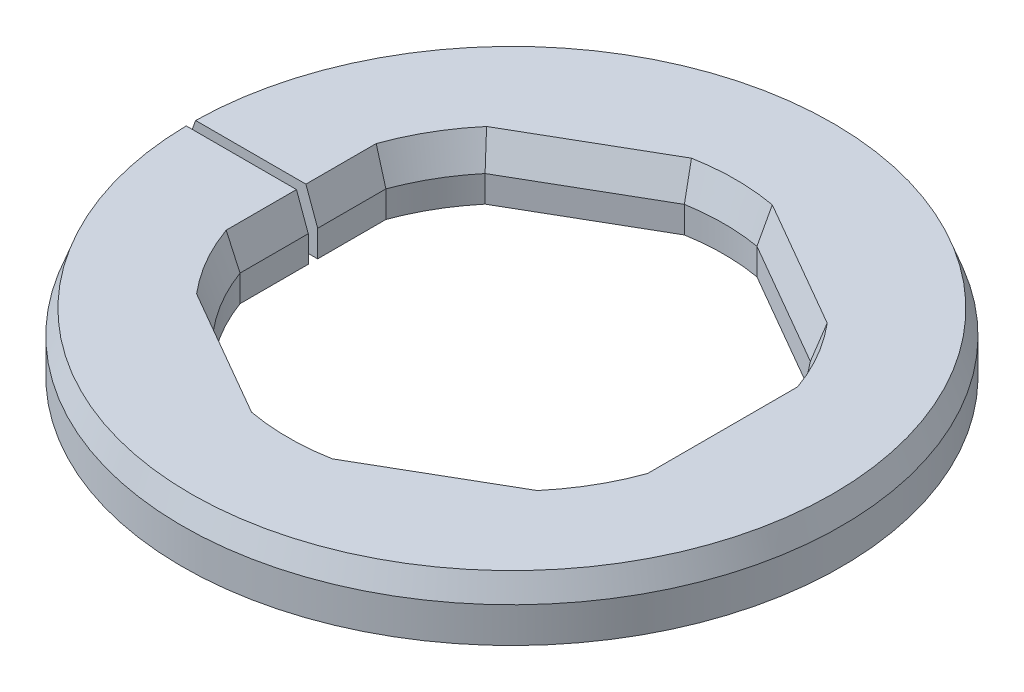
ISO-10303-21;
HEADER;
FILE_DESCRIPTION(('STEP AP214'),'2;1');
FILE_NAME('part.step','',(''),(''),'','','');
FILE_SCHEMA(('AUTOMOTIVE_DESIGN { 1 0 10303 214 1 1 1 1 }'));
ENDSEC;
DATA;
#1=APPLICATION_CONTEXT('core data for automotive mechanical design processes');
#2=APPLICATION_PROTOCOL_DEFINITION('international standard','automotive_design',2000,#1);
#3=PRODUCT_CONTEXT('',#1,'mechanical');
#4=PRODUCT('Part','Part','',(#3));
#5=PRODUCT_RELATED_PRODUCT_CATEGORY('part','',(#4));
#6=PRODUCT_DEFINITION_FORMATION('','',#4);
#7=PRODUCT_DEFINITION_CONTEXT('part definition',#1,'design');
#8=PRODUCT_DEFINITION('design','',#6,#7);
#9=PRODUCT_DEFINITION_SHAPE('','',#8);
#10=(LENGTH_UNIT() NAMED_UNIT(*) SI_UNIT(.MILLI.,.METRE.));
#11=(NAMED_UNIT(*) PLANE_ANGLE_UNIT() SI_UNIT($,.RADIAN.));
#12=(NAMED_UNIT(*) SI_UNIT($,.STERADIAN.) SOLID_ANGLE_UNIT());
#13=UNCERTAINTY_MEASURE_WITH_UNIT(LENGTH_MEASURE(1.E-05),#10,'distance_accuracy_value','');
#14=(GEOMETRIC_REPRESENTATION_CONTEXT(3) GLOBAL_UNCERTAINTY_ASSIGNED_CONTEXT((#13)) GLOBAL_UNIT_ASSIGNED_CONTEXT((#10,
#11,#12)) REPRESENTATION_CONTEXT('',''));
#15=CARTESIAN_POINT('',(0.,0.,0.));
#16=DIRECTION('',(0.,0.,1.));
#17=DIRECTION('',(1.,0.,0.));
#18=AXIS2_PLACEMENT_3D('',#15,#16,#17);
#19=CARTESIAN_POINT('',(-8.44999999989183,2.5,3.09798321482909));
#20=DIRECTION('',(1.,0.,0.));
#21=DIRECTION('',(0.,0.,-1.));
#22=AXIS2_PLACEMENT_3D('',#19,#20,#21);
#23=PLANE('',#22);
#24=DIRECTION('',(0.,1.,0.));
#25=VECTOR('',#24,1.);
#26=CARTESIAN_POINT('',(-8.44999999989183,2.5,-0.199999999999998));
#27=LINE('',#26,#25);
#28=CARTESIAN_POINT('',(-8.44999999989183,0.,-0.199999999999998));
#29=VERTEX_POINT('',#28);
#30=CARTESIAN_POINT('',(-8.44999999989183,1.12626129027269,-0.199999999999998));
#31=VERTEX_POINT('',#30);
#32=EDGE_CURVE('E205',#29,#31,#27,.T.);
#33=ORIENTED_EDGE('',*,*,#32,.F.);
#34=DIRECTION('',(0.,0.,1.));
#35=VECTOR('',#34,1.);
#36=CARTESIAN_POINT('',(-8.44999999989183,0.,3.09798321482909));
#37=LINE('',#36,#35);
#38=CARTESIAN_POINT('',(-8.44999999989183,0.,-3.09798321503491));
#39=VERTEX_POINT('',#38);
#40=EDGE_CURVE('E516',#39,#29,#37,.T.);
#41=ORIENTED_EDGE('',*,*,#40,.F.);
#42=DIRECTION('',(0.,-1.,0.));
#43=VECTOR('',#42,1.);
#44=CARTESIAN_POINT('',(-8.44999999989183,2.5,-3.09798321503491));
#45=LINE('',#44,#43);
#46=CARTESIAN_POINT('',(-8.44999999989183,1.12626129027269,-3.09798321503491));
#47=VERTEX_POINT('',#46);
#48=EDGE_CURVE('E502',#47,#39,#45,.T.);
#49=ORIENTED_EDGE('',*,*,#48,.F.);
#50=DIRECTION('',(0.,0.,1.));
#51=VECTOR('',#50,1.);
#52=CARTESIAN_POINT('',(-8.44999999989183,1.12626129027269,3.09798321482909));
#53=LINE('',#52,#51);
#54=EDGE_CURVE('E280',#47,#31,#53,.T.);
#55=ORIENTED_EDGE('',*,*,#54,.T.);
#56=EDGE_LOOP('',(#33,#41,#49,#55));
#57=FACE_BOUND('',#56,.T.);
#58=ADVANCED_FACE('F36',(#57),#23,.T.);
#59=CARTESIAN_POINT('',(-8.44999999989183,1.12626129027269,3.09798321482909));
#60=DIRECTION('',(-0.939692620785908,-0.342020143325671,0.));
#61=DIRECTION('',(0.,0.,1.));
#62=AXIS2_PLACEMENT_3D('',#59,#60,#61);
#63=PLANE('',#62);
#64=DIRECTION('',(0.342020143325671,-0.939692620785908,0.));
#65=VECTOR('',#64,1.);
#66=CARTESIAN_POINT('',(-8.44999999989183,1.12626129027269,-0.199999999999998));
#67=LINE('',#66,#65);
#68=CARTESIAN_POINT('',(-8.94999999989184,2.5,-0.199999999999998));
#69=VERTEX_POINT('',#68);
#70=EDGE_CURVE('E200',#31,#69,#67,.F.);
#71=ORIENTED_EDGE('',*,*,#70,.F.);
#72=ORIENTED_EDGE('',*,*,#54,.F.);
#73=CARTESIAN_POINT('',(-8.44999999989183,1.12626129027269,-3.09798321503491));
#74=CARTESIAN_POINT('',(-8.5333291870404,1.35520635034488,-3.11277417970992));
#75=CARTESIAN_POINT('',(-8.61666044747581,1.58415710672587,-3.12746390143958));
#76=CARTESIAN_POINT('',(-8.78332711414252,2.04207000996841,-3.15664085887206));
#77=CARTESIAN_POINT('',(-8.86666252037377,2.27103215682986,-3.17112809457677));
#78=CARTESIAN_POINT('',(-8.94999999989184,2.5,-3.18551408733803));
#79=B_SPLINE_CURVE_WITH_KNOTS('',3,(#73,#74,#75,#76,#77,#78),.UNSPECIFIED.,.F.,.F.,(4,2,4),(0.,
0.732260214431372,1.46452042202801),.UNSPECIFIED.);
#80=CARTESIAN_POINT('',(-8.94999999989184,2.5,-3.18551408733803));
#81=VERTEX_POINT('',#80);
#82=EDGE_CURVE('E226',#47,#81,#79,.T.);
#83=ORIENTED_EDGE('',*,*,#82,.T.);
#84=DIRECTION('',(0.,0.,-1.));
#85=VECTOR('',#84,1.);
#86=CARTESIAN_POINT('',(-8.94999999989184,2.5,6.51987144828503E-10));
#87=LINE('',#86,#85);
#88=EDGE_CURVE('E217',#69,#81,#87,.T.);
#89=ORIENTED_EDGE('',*,*,#88,.F.);
#90=EDGE_LOOP('',(#71,#72,#83,#89));
#91=FACE_BOUND('',#90,.T.);
#92=ADVANCED_FACE('F224',(#91),#63,.F.);
#93=CARTESIAN_POINT('',(5.49183125044051E-11,2.5,6.51987144828503E-10));
#94=DIRECTION('',(0.,1.,0.));
#95=DIRECTION('',(0.,0.,1.));
#96=AXIS2_PLACEMENT_3D('',#93,#94,#95);
#97=PLANE('',#96);
#98=DIRECTION('',(1.,0.,0.));
#99=VECTOR('',#98,1.);
#100=CARTESIAN_POINT('',(-17.4047921001665,2.5,0.200000000000002));
#101=LINE('',#100,#99);
#102=CARTESIAN_POINT('',(-13.6345629842229,2.5,0.200000000000002));
#103=VERTEX_POINT('',#102);
#104=CARTESIAN_POINT('',(-8.94999999989184,2.5,0.200000000000002));
#105=VERTEX_POINT('',#104);
#106=EDGE_CURVE('E221',#103,#105,#101,.T.);
#107=ORIENTED_EDGE('',*,*,#106,.F.);
#108=CARTESIAN_POINT('',(5.49183125044051E-11,2.5,6.51987144828503E-10));
#109=DIRECTION('',(0.,1.,0.));
#110=DIRECTION('',(0.,0.,1.));
#111=AXIS2_PLACEMENT_3D('',#108,#109,#110);
#112=CIRCLE('',#111,13.6360297657338);
#113=CARTESIAN_POINT('',(-13.6345629842038,2.5,-0.199999999999998));
#114=VERTEX_POINT('',#113);
#115=EDGE_CURVE('E210',#103,#114,#112,.T.);
#116=ORIENTED_EDGE('',*,*,#115,.T.);
#117=DIRECTION('',(-1.,0.,0.));
#118=VECTOR('',#117,1.);
#119=CARTESIAN_POINT('',(-17.4047921001665,2.5,-0.199999999999998));
#120=LINE('',#119,#118);
#121=EDGE_CURVE('E203',#69,#114,#120,.T.);
#122=ORIENTED_EDGE('',*,*,#121,.F.);
#123=ORIENTED_EDGE('',*,*,#88,.T.);
#124=CARTESIAN_POINT('',(-6.82127513029403E-10,2.5,-5.48507451092418E-10));
#125=DIRECTION('',(0.,1.,0.));
#126=DIRECTION('',(0.,0.,1.));
#127=AXIS2_PLACEMENT_3D('',#124,#125,#126);
#128=CIRCLE('',#127,9.49999999910464);
#129=CARTESIAN_POINT('',(-7.23373612364524,2.5,-6.1581703202398));
#130=VERTEX_POINT('',#129);
#131=EDGE_CURVE('E231',#81,#130,#128,.F.);
#132=ORIENTED_EDGE('',*,*,#131,.T.);
#133=DIRECTION('',(0.866025403784439,0.,-0.5));
#134=VECTOR('',#133,1.);
#135=CARTESIAN_POINT('',(-4.47500000023195,2.5,-7.75092736371561));
#136=LINE('',#135,#134);
#137=CARTESIAN_POINT('',(-1.71626387631926,2.5,-9.34368440747975));
#138=VERTEX_POINT('',#137);
#139=EDGE_CURVE('E238',#130,#138,#136,.T.);
#140=ORIENTED_EDGE('',*,*,#139,.T.);
#141=CARTESIAN_POINT('',(5.49183125044051E-11,2.5,6.51987144828503E-10));
#142=DIRECTION('',(0.,1.,0.));
#143=DIRECTION('',(0.,0.,1.));
#144=AXIS2_PLACEMENT_3D('',#141,#142,#143);
#145=CIRCLE('',#144,9.50000000063743);
#146=CARTESIAN_POINT('',(1.71626387633326,2.5,-9.34368440749735));
#147=VERTEX_POINT('',#146);
#148=EDGE_CURVE('E240',#138,#147,#145,.F.);
#149=ORIENTED_EDGE('',*,*,#148,.T.);
#150=DIRECTION('',(0.866025403784439,0.,0.5));
#151=VECTOR('',#150,1.);
#152=CARTESIAN_POINT('',(4.47500000032545,2.5,-7.75092736368732));
#153=LINE('',#152,#151);
#154=CARTESIAN_POINT('',(7.23373612366174,2.5,-6.15817032025597));
#155=VERTEX_POINT('',#154);
#156=EDGE_CURVE('E242',#147,#155,#153,.T.);
#157=ORIENTED_EDGE('',*,*,#156,.T.);
#158=CARTESIAN_POINT('',(3.36183591245036E-11,2.5,-1.37775181543098E-11));
#159=DIRECTION('',(0.,1.,0.));
#160=DIRECTION('',(0.,0.,1.));
#161=AXIS2_PLACEMENT_3D('',#158,#159,#160);
#162=CIRCLE('',#161,9.49999999996812);
#163=CARTESIAN_POINT('',(8.95000000000505,2.5,-3.18551408723826));
#164=VERTEX_POINT('',#163);
#165=EDGE_CURVE('E244',#155,#164,#162,.F.);
#166=ORIENTED_EDGE('',*,*,#165,.T.);
#167=DIRECTION('',(0.,0.,1.));
#168=VECTOR('',#167,1.);
#169=CARTESIAN_POINT('',(8.95000000000505,2.5,6.51987144828503E-10));
#170=LINE('',#169,#168);
#171=CARTESIAN_POINT('',(8.95000000000505,2.5,3.18551408723981));
#172=VERTEX_POINT('',#171);
#173=EDGE_CURVE('E246',#164,#172,#170,.T.);
#174=ORIENTED_EDGE('',*,*,#173,.T.);
#175=CARTESIAN_POINT('',(5.71074449468464E-11,2.5,4.01635526764568E-11));
#176=DIRECTION('',(0.,1.,0.));
#177=DIRECTION('',(0.,0.,1.));
#178=AXIS2_PLACEMENT_3D('',#175,#176,#177);
#179=CIRCLE('',#178,9.49999999993766);
#180=CARTESIAN_POINT('',(7.23373612366517,2.5,6.15817032025893));
#181=VERTEX_POINT('',#180);
#182=EDGE_CURVE('E248',#172,#181,#179,.F.);
#183=ORIENTED_EDGE('',*,*,#182,.T.);
#184=DIRECTION('',(-0.866025403784004,0.,0.500000000000753));
#185=VECTOR('',#184,1.);
#186=CARTESIAN_POINT('',(4.47499999977108,2.5,7.75092736401553));
#187=LINE('',#186,#185);
#188=CARTESIAN_POINT('',(1.71626387634008,2.5,9.34368440750476));
#189=VERTEX_POINT('',#188);
#190=EDGE_CURVE('E250',#181,#189,#187,.T.);
#191=ORIENTED_EDGE('',*,*,#190,.T.);
#192=CARTESIAN_POINT('',(5.49183125044051E-11,2.5,6.51987144828503E-10));
#193=DIRECTION('',(0.,1.,0.));
#194=DIRECTION('',(0.,0.,1.));
#195=AXIS2_PLACEMENT_3D('',#192,#193,#194);
#196=CIRCLE('',#195,9.49999999936342);
#197=CARTESIAN_POINT('',(-1.71626387635197,2.5,9.3436844074824));
#198=VERTEX_POINT('',#197);
#199=EDGE_CURVE('E252',#189,#198,#196,.F.);
#200=ORIENTED_EDGE('',*,*,#199,.T.);
#201=DIRECTION('',(-0.866025403768854,0.,-0.500000000026993));
#202=VECTOR('',#201,1.);
#203=CARTESIAN_POINT('',(-4.47499999986858,2.5,7.75092736383229));
#204=LINE('',#203,#202);
#205=CARTESIAN_POINT('',(-7.23373612359183,2.5,6.15817032006288));
#206=VERTEX_POINT('',#205);
#207=EDGE_CURVE('E254',#198,#206,#204,.T.);
#208=ORIENTED_EDGE('',*,*,#207,.T.);
#209=CARTESIAN_POINT('',(-6.62770753762795E-10,2.5,2.59207651671099E-10));
#210=DIRECTION('',(0.,1.,0.));
#211=DIRECTION('',(0.,0.,1.));
#212=AXIS2_PLACEMENT_3D('',#209,#210,#211);
#213=CIRCLE('',#212,9.49999999915155);
#214=CARTESIAN_POINT('',(-8.94999999989184,2.5,3.18551408713424));
#215=VERTEX_POINT('',#214);
#216=EDGE_CURVE('E256',#206,#215,#213,.F.);
#217=ORIENTED_EDGE('',*,*,#216,.T.);
#218=EDGE_CURVE('E227',#215,#105,#87,.T.);
#219=ORIENTED_EDGE('',*,*,#218,.T.);
#220=EDGE_LOOP('',(#107,#116,#122,#123,#132,#140,#149,#157,#166,#174,#183,#191,#200,#208,#217,#219));
#221=FACE_BOUND('',#220,.T.);
#222=ADVANCED_FACE('F216',(#221),#97,.T.);
#223=CARTESIAN_POINT('',(5.49183125044051E-11,0.,6.51987144828503E-10));
#224=DIRECTION('',(0.,1.,0.));
#225=DIRECTION('',(0.,0.,1.));
#226=AXIS2_PLACEMENT_3D('',#223,#224,#225);
#227=PLANE('',#226);
#228=ORIENTED_EDGE('',*,*,#40,.T.);
#229=DIRECTION('',(-1.,0.,0.));
#230=VECTOR('',#229,1.);
#231=CARTESIAN_POINT('',(-17.4047921001665,0.,-0.199999999999998));
#232=LINE('',#231,#230);
#233=CARTESIAN_POINT('',(-13.9985713556135,0.,-0.199999999999998));
#234=VERTEX_POINT('',#233);
#235=EDGE_CURVE('E479',#29,#234,#232,.T.);
#236=ORIENTED_EDGE('',*,*,#235,.T.);
#237=CARTESIAN_POINT('',(5.49183125044051E-11,0.,6.51987144828503E-10));
#238=DIRECTION('',(0.,1.,0.));
#239=DIRECTION('',(0.,0.,1.));
#240=AXIS2_PLACEMENT_3D('',#237,#238,#239);
#241=CIRCLE('',#240,14.);
#242=CARTESIAN_POINT('',(-13.9985713556321,0.,0.200000000000002));
#243=VERTEX_POINT('',#242);
#244=EDGE_CURVE('E233',#243,#234,#241,.T.);
#245=ORIENTED_EDGE('',*,*,#244,.F.);
#246=DIRECTION('',(1.,0.,0.));
#247=VECTOR('',#246,1.);
#248=CARTESIAN_POINT('',(-17.4047921001665,0.,0.200000000000002));
#249=LINE('',#248,#247);
#250=CARTESIAN_POINT('',(-8.44999999989183,0.,0.200000000000002));
#251=VERTEX_POINT('',#250);
#252=EDGE_CURVE('E220',#243,#251,#249,.T.);
#253=ORIENTED_EDGE('',*,*,#252,.T.);
#254=CARTESIAN_POINT('',(-8.44999999989183,0.,3.09798321482908));
#255=VERTEX_POINT('',#254);
#256=EDGE_CURVE('E474',#251,#255,#37,.T.);
#257=ORIENTED_EDGE('',*,*,#256,.T.);
#258=CARTESIAN_POINT('',(-6.62770753762795E-10,0.,2.59207651671099E-10));
#259=DIRECTION('',(0.,1.,0.));
#260=DIRECTION('',(0.,0.,1.));
#261=AXIS2_PLACEMENT_3D('',#258,#259,#260);
#262=CIRCLE('',#261,8.99999999915155);
#263=CARTESIAN_POINT('',(-6.90793216455626,0.,5.76892305432862));
#264=VERTEX_POINT('',#263);
#265=EDGE_CURVE('E527',#255,#264,#262,.T.);
#266=ORIENTED_EDGE('',*,*,#265,.T.);
#267=DIRECTION('',(0.866025403768854,0.,0.500000000026993));
#268=VECTOR('',#267,1.);
#269=CARTESIAN_POINT('',(-1.54206783537336,0.,8.86690626944038));
#270=LINE('',#269,#268);
#271=CARTESIAN_POINT('',(-1.54206783537336,0.,8.86690626944038));
#272=VERTEX_POINT('',#271);
#273=EDGE_CURVE('E498',#264,#272,#270,.T.);
#274=ORIENTED_EDGE('',*,*,#273,.T.);
#275=CARTESIAN_POINT('',(5.49183125044051E-11,0.,6.51987144828503E-10));
#276=DIRECTION('',(0.,1.,0.));
#277=DIRECTION('',(0.,0.,1.));
#278=AXIS2_PLACEMENT_3D('',#275,#276,#277);
#279=CIRCLE('',#278,8.99999999936341);
#280=CARTESIAN_POINT('',(1.54206783537201,0.,8.86690626945972));
#281=VERTEX_POINT('',#280);
#282=EDGE_CURVE('E530',#272,#281,#279,.T.);
#283=ORIENTED_EDGE('',*,*,#282,.T.);
#284=DIRECTION('',(0.866025403784004,0.,-0.500000000000753));
#285=VECTOR('',#284,1.);
#286=CARTESIAN_POINT('',(6.90793216463169,0.,5.76892305452042));
#287=LINE('',#286,#285);
#288=CARTESIAN_POINT('',(6.90793216463169,0.,5.76892305452042));
#289=VERTEX_POINT('',#288);
#290=EDGE_CURVE('E533',#281,#289,#287,.T.);
#291=ORIENTED_EDGE('',*,*,#290,.T.);
#292=CARTESIAN_POINT('',(5.71074449468464E-11,0.,4.01635526764568E-11));
#293=DIRECTION('',(0.,1.,0.));
#294=DIRECTION('',(0.,0.,1.));
#295=AXIS2_PLACEMENT_3D('',#292,#293,#294);
#296=CIRCLE('',#295,8.99999999993766);
#297=CARTESIAN_POINT('',(8.45000000000505,0.,3.09798321493299));
#298=VERTEX_POINT('',#297);
#299=EDGE_CURVE('E536',#289,#298,#296,.T.);
#300=ORIENTED_EDGE('',*,*,#299,.T.);
#301=DIRECTION('',(0.,0.,-1.));
#302=VECTOR('',#301,1.);
#303=CARTESIAN_POINT('',(8.45000000000505,0.,-3.09798321493101));
#304=LINE('',#303,#302);
#305=CARTESIAN_POINT('',(8.45000000000505,0.,-3.09798321493101));
#306=VERTEX_POINT('',#305);
#307=EDGE_CURVE('E539',#298,#306,#304,.T.);
#308=ORIENTED_EDGE('',*,*,#307,.T.);
#309=CARTESIAN_POINT('',(3.36183591245036E-11,0.,-1.37775181543098E-11));
#310=DIRECTION('',(0.,1.,0.));
#311=DIRECTION('',(0.,0.,1.));
#312=AXIS2_PLACEMENT_3D('',#309,#310,#311);
#313=CIRCLE('',#312,8.99999999996811);
#314=CARTESIAN_POINT('',(6.90793216462852,0.,-5.76892305451722));
#315=VERTEX_POINT('',#314);
#316=EDGE_CURVE('E542',#306,#315,#313,.T.);
#317=ORIENTED_EDGE('',*,*,#316,.T.);
#318=DIRECTION('',(-0.866025403784439,0.,-0.5));
#319=VECTOR('',#318,1.);
#320=CARTESIAN_POINT('',(1.542067835371,0.,-8.86690626944905));
#321=LINE('',#320,#319);
#322=CARTESIAN_POINT('',(1.542067835371,0.,-8.86690626944905));
#323=VERTEX_POINT('',#322);
#324=EDGE_CURVE('E545',#315,#323,#321,.T.);
#325=ORIENTED_EDGE('',*,*,#324,.T.);
#326=CARTESIAN_POINT('',(5.49183125044051E-11,0.,6.51987144828503E-10));
#327=DIRECTION('',(0.,1.,0.));
#328=DIRECTION('',(0.,0.,-1.));
#329=AXIS2_PLACEMENT_3D('',#326,#327,#328);
#330=CIRCLE('',#329,9.00000000063742);
#331=CARTESIAN_POINT('',(-1.54206783535467,0.,-8.86690626943279));
#332=VERTEX_POINT('',#331);
#333=EDGE_CURVE('E548',#323,#332,#330,.T.);
#334=ORIENTED_EDGE('',*,*,#333,.T.);
#335=DIRECTION('',(-0.866025403784439,0.,0.5));
#336=VECTOR('',#335,1.);
#337=CARTESIAN_POINT('',(-6.90793216461219,0.,-5.76892305450095));
#338=LINE('',#337,#336);
#339=CARTESIAN_POINT('',(-6.90793216461219,0.,-5.76892305450095));
#340=VERTEX_POINT('',#339);
#341=EDGE_CURVE('E551',#332,#340,#338,.T.);
#342=ORIENTED_EDGE('',*,*,#341,.T.);
#343=CARTESIAN_POINT('',(-6.82127513029403E-10,0.,-5.48507451092418E-10));
#344=DIRECTION('',(0.,1.,0.));
#345=DIRECTION('',(0.,0.,1.));
#346=AXIS2_PLACEMENT_3D('',#343,#344,#345);
#347=CIRCLE('',#346,8.99999999910464);
#348=EDGE_CURVE('E524',#340,#39,#347,.T.);
#349=ORIENTED_EDGE('',*,*,#348,.T.);
#350=EDGE_LOOP('',(#228,#236,#245,#253,#257,#266,#274,#283,#291,#300,#308,#317,#325,#334,#342,#349));
#351=FACE_BOUND('',#350,.T.);
#352=ADVANCED_FACE('F513',(#351),#227,.F.);
#353=CARTESIAN_POINT('',(5.49183125044051E-11,2.5,6.51987144828503E-10));
#354=DIRECTION('',(0.,-1.,0.));
#355=DIRECTION('',(0.,0.,-1.));
#356=AXIS2_PLACEMENT_3D('',#353,#354,#355);
#357=CYLINDRICAL_SURFACE('',#356,14.);
#358=DIRECTION('',(0.,-1.,0.));
#359=VECTOR('',#358,1.);
#360=CARTESIAN_POINT('',(-13.9985713556135,2.5,-0.199999999999998));
#361=LINE('',#360,#359);
#362=CARTESIAN_POINT('',(-13.9985713556135,1.50000000000002,-0.199999999999998));
#363=VERTEX_POINT('',#362);
#364=EDGE_CURVE('E291',#234,#363,#361,.F.);
#365=ORIENTED_EDGE('',*,*,#364,.T.);
#366=CARTESIAN_POINT('',(5.49183125044051E-11,1.50000000000002,6.51987144828503E-10));
#367=DIRECTION('',(0.,1.,0.));
#368=DIRECTION('',(0.,0.,1.));
#369=AXIS2_PLACEMENT_3D('',#366,#367,#368);
#370=CIRCLE('',#369,14.);
#371=CARTESIAN_POINT('',(-13.9985713556321,1.50000000000002,0.200000000000002));
#372=VERTEX_POINT('',#371);
#373=EDGE_CURVE('E51',#363,#372,#370,.F.);
#374=ORIENTED_EDGE('',*,*,#373,.T.);
#375=DIRECTION('',(0.,-1.,0.));
#376=VECTOR('',#375,1.);
#377=CARTESIAN_POINT('',(-13.9985713556321,2.5,0.200000000000002));
#378=LINE('',#377,#376);
#379=EDGE_CURVE('E478',#372,#243,#378,.T.);
#380=ORIENTED_EDGE('',*,*,#379,.T.);
#381=ORIENTED_EDGE('',*,*,#244,.T.);
#382=EDGE_LOOP('',(#365,#374,#380,#381));
#383=FACE_BOUND('',#382,.T.);
#384=ADVANCED_FACE('F466',(#383),#357,.T.);
#385=CARTESIAN_POINT('',(-6.82127513029403E-10,2.5,-5.48507451092418E-10));
#386=DIRECTION('',(0.,-1.,0.));
#387=DIRECTION('',(0.,0.,-1.));
#388=AXIS2_PLACEMENT_3D('',#385,#386,#387);
#389=CYLINDRICAL_SURFACE('',#388,8.99999999910464);
#390=DIRECTION('',(0.,-1.,0.));
#391=VECTOR('',#390,1.);
#392=CARTESIAN_POINT('',(-6.90793216461219,2.5,-5.76892305450095));
#393=LINE('',#392,#391);
#394=CARTESIAN_POINT('',(-6.90793216461219,1.12626129027269,-5.76892305450095));
#395=VERTEX_POINT('',#394);
#396=EDGE_CURVE('E554',#395,#340,#393,.T.);
#397=ORIENTED_EDGE('',*,*,#396,.F.);
#398=CARTESIAN_POINT('',(-6.82127513029403E-10,1.12626129027269,-5.48507451092418E-10));
#399=DIRECTION('',(0.,1.,0.));
#400=DIRECTION('',(0.,0.,1.));
#401=AXIS2_PLACEMENT_3D('',#398,#399,#400);
#402=CIRCLE('',#401,8.99999999910464);
#403=EDGE_CURVE('E277',#395,#47,#402,.T.);
#404=ORIENTED_EDGE('',*,*,#403,.T.);
#405=ORIENTED_EDGE('',*,*,#48,.T.);
#406=ORIENTED_EDGE('',*,*,#348,.F.);
#407=EDGE_LOOP('',(#397,#404,#405,#406));
#408=FACE_BOUND('',#407,.T.);
#409=ADVANCED_FACE('F458',(#408),#389,.F.);
#410=DIRECTION('',(0.,-1.,0.));
#411=VECTOR('',#410,1.);
#412=CARTESIAN_POINT('',(-8.44999999989183,2.5,0.200000000000002));
#413=LINE('',#412,#411);
#414=CARTESIAN_POINT('',(-8.44999999989183,1.12626129027269,0.200000000000002));
#415=VERTEX_POINT('',#414);
#416=EDGE_CURVE('E470',#415,#251,#413,.T.);
#417=ORIENTED_EDGE('',*,*,#416,.F.);
#418=CARTESIAN_POINT('',(-8.44999999989183,1.12626129027269,3.09798321482908));
#419=VERTEX_POINT('',#418);
#420=EDGE_CURVE('E279',#415,#419,#53,.T.);
#421=ORIENTED_EDGE('',*,*,#420,.T.);
#422=DIRECTION('',(0.,-1.,0.));
#423=VECTOR('',#422,1.);
#424=CARTESIAN_POINT('',(-8.44999999989183,2.5,3.09798321482908));
#425=LINE('',#424,#423);
#426=EDGE_CURVE('E494',#419,#255,#425,.T.);
#427=ORIENTED_EDGE('',*,*,#426,.T.);
#428=ORIENTED_EDGE('',*,*,#256,.F.);
#429=EDGE_LOOP('',(#417,#421,#427,#428));
#430=FACE_BOUND('',#429,.T.);
#431=ADVANCED_FACE('F450',(#430),#23,.T.);
#432=CARTESIAN_POINT('',(-6.62770753762795E-10,2.5,2.59207651671099E-10));
#433=DIRECTION('',(0.,-1.,0.));
#434=DIRECTION('',(0.,0.,-1.));
#435=AXIS2_PLACEMENT_3D('',#432,#433,#434);
#436=CYLINDRICAL_SURFACE('',#435,8.99999999915155);
#437=ORIENTED_EDGE('',*,*,#426,.F.);
#438=CARTESIAN_POINT('',(-6.62770753762795E-10,1.12626129027269,2.59207651671099E-10));
#439=DIRECTION('',(0.,1.,0.));
#440=DIRECTION('',(0.,0.,1.));
#441=AXIS2_PLACEMENT_3D('',#438,#439,#440);
#442=CIRCLE('',#441,8.99999999915155);
#443=CARTESIAN_POINT('',(-6.90793216455626,1.12626129027269,5.76892305432862));
#444=VERTEX_POINT('',#443);
#445=EDGE_CURVE('E228',#419,#444,#442,.T.);
#446=ORIENTED_EDGE('',*,*,#445,.T.);
#447=DIRECTION('',(0.,-1.,0.));
#448=VECTOR('',#447,1.);
#449=CARTESIAN_POINT('',(-6.90793216455626,2.5,5.76892305432862));
#450=LINE('',#449,#448);
#451=EDGE_CURVE('E492',#444,#264,#450,.T.);
#452=ORIENTED_EDGE('',*,*,#451,.T.);
#453=ORIENTED_EDGE('',*,*,#265,.F.);
#454=EDGE_LOOP('',(#437,#446,#452,#453));
#455=FACE_BOUND('',#454,.T.);
#456=ADVANCED_FACE('F457',(#455),#436,.F.);
#457=CARTESIAN_POINT('',(-1.54206783537336,2.5,8.86690626944038));
#458=DIRECTION('',(0.500000000026993,0.,-0.866025403768854));
#459=DIRECTION('',(-0.866025403768854,0.,-0.500000000026993));
#460=AXIS2_PLACEMENT_3D('',#457,#458,#459);
#461=PLANE('',#460);
#462=ORIENTED_EDGE('',*,*,#451,.F.);
#463=DIRECTION('',(0.866025403768854,0.,0.500000000026993));
#464=VECTOR('',#463,1.);
#465=CARTESIAN_POINT('',(-1.54206783537336,1.12626129027269,8.86690626944038));
#466=LINE('',#465,#464);
#467=CARTESIAN_POINT('',(-1.54206783537336,1.12626129027269,8.86690626944038));
#468=VERTEX_POINT('',#467);
#469=EDGE_CURVE('E259',#444,#468,#466,.T.);
#470=ORIENTED_EDGE('',*,*,#469,.T.);
#471=DIRECTION('',(0.,-1.,0.));
#472=VECTOR('',#471,1.);
#473=CARTESIAN_POINT('',(-1.54206783537336,2.5,8.86690626944038));
#474=LINE('',#473,#472);
#475=EDGE_CURVE('E500',#468,#272,#474,.T.);
#476=ORIENTED_EDGE('',*,*,#475,.T.);
#477=ORIENTED_EDGE('',*,*,#273,.F.);
#478=EDGE_LOOP('',(#462,#470,#476,#477));
#479=FACE_BOUND('',#478,.T.);
#480=ADVANCED_FACE('F464',(#479),#461,.T.);
#481=CARTESIAN_POINT('',(5.49183125044051E-11,2.5,6.51987144828503E-10));
#482=DIRECTION('',(0.,-1.,0.));
#483=DIRECTION('',(0.,0.,-1.));
#484=AXIS2_PLACEMENT_3D('',#481,#482,#483);
#485=CYLINDRICAL_SURFACE('',#484,8.99999999936341);
#486=ORIENTED_EDGE('',*,*,#475,.F.);
#487=CARTESIAN_POINT('',(5.49183125044051E-11,1.12626129027269,6.51987144828503E-10));
#488=DIRECTION('',(0.,1.,0.));
#489=DIRECTION('',(0.,0.,1.));
#490=AXIS2_PLACEMENT_3D('',#487,#488,#489);
#491=CIRCLE('',#490,8.99999999936341);
#492=CARTESIAN_POINT('',(1.54206783537201,1.12626129027269,8.86690626945972));
#493=VERTEX_POINT('',#492);
#494=EDGE_CURVE('E261',#468,#493,#491,.T.);
#495=ORIENTED_EDGE('',*,*,#494,.T.);
#496=DIRECTION('',(0.,-1.,0.));
#497=VECTOR('',#496,1.);
#498=CARTESIAN_POINT('',(1.54206783537201,2.5,8.86690626945972));
#499=LINE('',#498,#497);
#500=EDGE_CURVE('E504',#493,#281,#499,.T.);
#501=ORIENTED_EDGE('',*,*,#500,.T.);
#502=ORIENTED_EDGE('',*,*,#282,.F.);
#503=EDGE_LOOP('',(#486,#495,#501,#502));
#504=FACE_BOUND('',#503,.T.);
#505=ADVANCED_FACE('F571',(#504),#485,.F.);
#506=CARTESIAN_POINT('',(6.90793216463169,2.5,5.76892305452042));
#507=DIRECTION('',(-0.500000000000753,0.,-0.866025403784004));
#508=DIRECTION('',(-0.866025403784004,0.,0.500000000000753));
#509=AXIS2_PLACEMENT_3D('',#506,#507,#508);
#510=PLANE('',#509);
#511=ORIENTED_EDGE('',*,*,#500,.F.);
#512=DIRECTION('',(0.866025403784004,0.,-0.500000000000753));
#513=VECTOR('',#512,1.);
#514=CARTESIAN_POINT('',(6.90793216463169,1.12626129027269,5.76892305452042));
#515=LINE('',#514,#513);
#516=CARTESIAN_POINT('',(6.90793216463169,1.12626129027269,5.76892305452042));
#517=VERTEX_POINT('',#516);
#518=EDGE_CURVE('E263',#493,#517,#515,.T.);
#519=ORIENTED_EDGE('',*,*,#518,.T.);
#520=DIRECTION('',(0.,-1.,0.));
#521=VECTOR('',#520,1.);
#522=CARTESIAN_POINT('',(6.90793216463169,2.5,5.76892305452042));
#523=LINE('',#522,#521);
#524=EDGE_CURVE('E566',#517,#289,#523,.T.);
#525=ORIENTED_EDGE('',*,*,#524,.T.);
#526=ORIENTED_EDGE('',*,*,#290,.F.);
#527=EDGE_LOOP('',(#511,#519,#525,#526));
#528=FACE_BOUND('',#527,.T.);
#529=ADVANCED_FACE('F575',(#528),#510,.T.);
#530=CARTESIAN_POINT('',(5.71074449468464E-11,2.5,4.01635526764568E-11));
#531=DIRECTION('',(0.,-1.,0.));
#532=DIRECTION('',(0.,0.,-1.));
#533=AXIS2_PLACEMENT_3D('',#530,#531,#532);
#534=CYLINDRICAL_SURFACE('',#533,8.99999999993766);
#535=ORIENTED_EDGE('',*,*,#524,.F.);
#536=CARTESIAN_POINT('',(5.71074449468464E-11,1.12626129027269,4.01635526764568E-11));
#537=DIRECTION('',(0.,1.,0.));
#538=DIRECTION('',(0.,0.,1.));
#539=AXIS2_PLACEMENT_3D('',#536,#537,#538);
#540=CIRCLE('',#539,8.99999999993766);
#541=CARTESIAN_POINT('',(8.45000000000505,1.12626129027269,3.09798321493299));
#542=VERTEX_POINT('',#541);
#543=EDGE_CURVE('E265',#517,#542,#540,.T.);
#544=ORIENTED_EDGE('',*,*,#543,.T.);
#545=DIRECTION('',(0.,-1.,0.));
#546=VECTOR('',#545,1.);
#547=CARTESIAN_POINT('',(8.45000000000505,2.5,3.09798321493299));
#548=LINE('',#547,#546);
#549=EDGE_CURVE('E564',#542,#298,#548,.T.);
#550=ORIENTED_EDGE('',*,*,#549,.T.);
#551=ORIENTED_EDGE('',*,*,#299,.F.);
#552=EDGE_LOOP('',(#535,#544,#550,#551));
#553=FACE_BOUND('',#552,.T.);
#554=ADVANCED_FACE('F580',(#553),#534,.F.);
#555=CARTESIAN_POINT('',(8.45000000000505,2.5,-3.09798321493101));
#556=DIRECTION('',(-1.,0.,0.));
#557=DIRECTION('',(0.,0.,1.));
#558=AXIS2_PLACEMENT_3D('',#555,#556,#557);
#559=PLANE('',#558);
#560=ORIENTED_EDGE('',*,*,#549,.F.);
#561=DIRECTION('',(0.,0.,-1.));
#562=VECTOR('',#561,1.);
#563=CARTESIAN_POINT('',(8.45000000000505,1.12626129027269,-3.09798321493101));
#564=LINE('',#563,#562);
#565=CARTESIAN_POINT('',(8.45000000000505,1.12626129027269,-3.09798321493101));
#566=VERTEX_POINT('',#565);
#567=EDGE_CURVE('E267',#542,#566,#564,.T.);
#568=ORIENTED_EDGE('',*,*,#567,.T.);
#569=DIRECTION('',(0.,-1.,0.));
#570=VECTOR('',#569,1.);
#571=CARTESIAN_POINT('',(8.45000000000505,2.5,-3.09798321493101));
#572=LINE('',#571,#570);
#573=EDGE_CURVE('E562',#566,#306,#572,.T.);
#574=ORIENTED_EDGE('',*,*,#573,.T.);
#575=ORIENTED_EDGE('',*,*,#307,.F.);
#576=EDGE_LOOP('',(#560,#568,#574,#575));
#577=FACE_BOUND('',#576,.T.);
#578=ADVANCED_FACE('F585',(#577),#559,.T.);
#579=CARTESIAN_POINT('',(3.36183591245036E-11,2.5,-1.37775181543098E-11));
#580=DIRECTION('',(0.,-1.,0.));
#581=DIRECTION('',(0.,0.,-1.));
#582=AXIS2_PLACEMENT_3D('',#579,#580,#581);
#583=CYLINDRICAL_SURFACE('',#582,8.99999999996811);
#584=ORIENTED_EDGE('',*,*,#573,.F.);
#585=CARTESIAN_POINT('',(3.36183591245036E-11,1.12626129027269,-1.37775181543098E-11));
#586=DIRECTION('',(0.,1.,0.));
#587=DIRECTION('',(0.,0.,1.));
#588=AXIS2_PLACEMENT_3D('',#585,#586,#587);
#589=CIRCLE('',#588,8.99999999996811);
#590=CARTESIAN_POINT('',(6.90793216462852,1.12626129027269,-5.76892305451722));
#591=VERTEX_POINT('',#590);
#592=EDGE_CURVE('E269',#566,#591,#589,.T.);
#593=ORIENTED_EDGE('',*,*,#592,.T.);
#594=DIRECTION('',(0.,-1.,0.));
#595=VECTOR('',#594,1.);
#596=CARTESIAN_POINT('',(6.90793216462852,2.5,-5.76892305451722));
#597=LINE('',#596,#595);
#598=EDGE_CURVE('E560',#591,#315,#597,.T.);
#599=ORIENTED_EDGE('',*,*,#598,.T.);
#600=ORIENTED_EDGE('',*,*,#316,.F.);
#601=EDGE_LOOP('',(#584,#593,#599,#600));
#602=FACE_BOUND('',#601,.T.);
#603=ADVANCED_FACE('F590',(#602),#583,.F.);
#604=CARTESIAN_POINT('',(1.542067835371,2.5,-8.86690626944905));
#605=DIRECTION('',(-0.5,0.,0.866025403784439));
#606=DIRECTION('',(0.866025403784439,0.,0.5));
#607=AXIS2_PLACEMENT_3D('',#604,#605,#606);
#608=PLANE('',#607);
#609=ORIENTED_EDGE('',*,*,#598,.F.);
#610=DIRECTION('',(-0.866025403784439,0.,-0.5));
#611=VECTOR('',#610,1.);
#612=CARTESIAN_POINT('',(1.542067835371,1.12626129027269,-8.86690626944905));
#613=LINE('',#612,#611);
#614=CARTESIAN_POINT('',(1.542067835371,1.12626129027269,-8.86690626944905));
#615=VERTEX_POINT('',#614);
#616=EDGE_CURVE('E271',#591,#615,#613,.T.);
#617=ORIENTED_EDGE('',*,*,#616,.T.);
#618=DIRECTION('',(0.,-1.,0.));
#619=VECTOR('',#618,1.);
#620=CARTESIAN_POINT('',(1.542067835371,2.5,-8.86690626944905));
#621=LINE('',#620,#619);
#622=EDGE_CURVE('E558',#615,#323,#621,.T.);
#623=ORIENTED_EDGE('',*,*,#622,.T.);
#624=ORIENTED_EDGE('',*,*,#324,.F.);
#625=EDGE_LOOP('',(#609,#617,#623,#624));
#626=FACE_BOUND('',#625,.T.);
#627=ADVANCED_FACE('F595',(#626),#608,.T.);
#628=CARTESIAN_POINT('',(5.49183125044051E-11,2.5,6.51987144828503E-10));
#629=DIRECTION('',(0.,-1.,0.));
#630=DIRECTION('',(0.,0.,-1.));
#631=AXIS2_PLACEMENT_3D('',#628,#629,#630);
#632=CYLINDRICAL_SURFACE('',#631,9.00000000063742);
#633=ORIENTED_EDGE('',*,*,#622,.F.);
#634=CARTESIAN_POINT('',(5.49183125044051E-11,1.12626129027269,6.51987144828503E-10));
#635=DIRECTION('',(0.,1.,0.));
#636=DIRECTION('',(0.,0.,1.));
#637=AXIS2_PLACEMENT_3D('',#634,#635,#636);
#638=CIRCLE('',#637,9.00000000063742);
#639=CARTESIAN_POINT('',(-1.54206783535467,1.12626129027269,-8.86690626943279));
#640=VERTEX_POINT('',#639);
#641=EDGE_CURVE('E273',#615,#640,#638,.T.);
#642=ORIENTED_EDGE('',*,*,#641,.T.);
#643=DIRECTION('',(0.,-1.,0.));
#644=VECTOR('',#643,1.);
#645=CARTESIAN_POINT('',(-1.54206783535467,2.5,-8.86690626943279));
#646=LINE('',#645,#644);
#647=EDGE_CURVE('E556',#640,#332,#646,.T.);
#648=ORIENTED_EDGE('',*,*,#647,.T.);
#649=ORIENTED_EDGE('',*,*,#333,.F.);
#650=EDGE_LOOP('',(#633,#642,#648,#649));
#651=FACE_BOUND('',#650,.T.);
#652=ADVANCED_FACE('F443',(#651),#632,.F.);
#653=CARTESIAN_POINT('',(-6.90793216461219,2.5,-5.76892305450095));
#654=DIRECTION('',(0.5,0.,0.866025403784439));
#655=DIRECTION('',(0.866025403784439,0.,-0.5));
#656=AXIS2_PLACEMENT_3D('',#653,#654,#655);
#657=PLANE('',#656);
#658=ORIENTED_EDGE('',*,*,#647,.F.);
#659=DIRECTION('',(-0.866025403784439,0.,0.5));
#660=VECTOR('',#659,1.);
#661=CARTESIAN_POINT('',(-6.90793216461219,1.12626129027269,-5.76892305450095));
#662=LINE('',#661,#660);
#663=EDGE_CURVE('E275',#640,#395,#662,.T.);
#664=ORIENTED_EDGE('',*,*,#663,.T.);
#665=ORIENTED_EDGE('',*,*,#396,.T.);
#666=ORIENTED_EDGE('',*,*,#341,.F.);
#667=EDGE_LOOP('',(#658,#664,#665,#666));
#668=FACE_BOUND('',#667,.T.);
#669=ADVANCED_FACE('F435',(#668),#657,.T.);
#670=CARTESIAN_POINT('',(3.36183591245036E-11,1.12626129027269,-1.37775181543098E-11));
#671=DIRECTION('',(0.,1.,0.));
#672=DIRECTION('',(0.,0.,1.));
#673=AXIS2_PLACEMENT_3D('',#670,#671,#672);
#674=CONICAL_SURFACE('',#673,8.99999999996811,0.349065850398869);
#675=CARTESIAN_POINT('',(8.45000000000505,1.12626129027269,-3.09798321493101));
#676=CARTESIAN_POINT('',(8.53332918715361,1.35520635034488,-3.1127741796067));
#677=CARTESIAN_POINT('',(8.61666044758902,1.58415710672587,-3.12746390133705));
#678=CARTESIAN_POINT('',(8.78332711425573,2.04207000996841,-3.15664085877091));
#679=CARTESIAN_POINT('',(8.86666252048699,2.27103215682986,-3.17112809447631));
#680=CARTESIAN_POINT('',(8.95000000000505,2.5,-3.18551408723826));
#681=B_SPLINE_CURVE_WITH_KNOTS('',3,(#675,#676,#677,#678,#679,#680),.UNSPECIFIED.,.F.,.F.,(4,2,
4),(0.,0.732260214431496,1.46452042202825),.UNSPECIFIED.);
#682=EDGE_CURVE('E416',#164,#566,#681,.F.);
#683=ORIENTED_EDGE('',*,*,#682,.F.);
#684=ORIENTED_EDGE('',*,*,#165,.F.);
#685=CARTESIAN_POINT('',(6.90793216462852,1.12626129027269,-5.76892305451722));
#686=CARTESIAN_POINT('',(6.96240610935838,1.35520635034488,-5.83369276512677));
#687=CARTESIAN_POINT('',(7.01679341176904,1.58415710672587,-5.89851489272806));
#688=CARTESIAN_POINT('',(7.12539473144517,2.04207000996841,-6.02826398130862));
#689=CARTESIAN_POINT('',(7.17960874871224,2.27103215682986,-6.09319094228691));
#690=CARTESIAN_POINT('',(7.23373612366174,2.5,-6.15817032025597));
#691=B_SPLINE_CURVE_WITH_KNOTS('',3,(#685,#686,#687,#688,#689,#690),.UNSPECIFIED.,.F.,.F.,(4,2,
4),(0.,0.732260214431486,1.46452042202824),.UNSPECIFIED.);
#692=EDGE_CURVE('E423',#591,#155,#691,.T.);
#693=ORIENTED_EDGE('',*,*,#692,.F.);
#694=ORIENTED_EDGE('',*,*,#592,.F.);
#695=EDGE_LOOP('',(#683,#684,#693,#694));
#696=FACE_BOUND('',#695,.T.);
#697=ADVANCED_FACE('F430',(#696),#674,.F.);
#698=CARTESIAN_POINT('',(1.542067835371,1.12626129027269,-8.86690626944905));
#699=DIRECTION('',(0.469846310392954,-0.342020143325672,-0.813797681349373));
#700=DIRECTION('',(-0.866025403784439,0.,-0.5));
#701=AXIS2_PLACEMENT_3D('',#698,#699,#700);
#702=PLANE('',#701);
#703=ORIENTED_EDGE('',*,*,#692,.T.);
#704=ORIENTED_EDGE('',*,*,#156,.F.);
#705=CARTESIAN_POINT('',(1.542067835371,1.12626129027269,-8.86690626944905));
#706=CARTESIAN_POINT('',(1.57092307778895,1.35520635034488,-8.94646694473467));
#707=CARTESIAN_POINT('',(1.59986703581295,1.58415710672587,-9.0259787940667));
#708=CARTESIAN_POINT('',(1.65793238280202,2.04207000996841,-9.18490484008189));
#709=CARTESIAN_POINT('',(1.68705377176545,2.27103215682986,-9.26431903676596));
#710=CARTESIAN_POINT('',(1.71626387633326,2.5,-9.34368440749736));
#711=B_SPLINE_CURVE_WITH_KNOTS('',3,(#705,#706,#707,#708,#709,#710),.UNSPECIFIED.,.F.,.F.,(4,2,
4),(0.,0.732260214431644,1.46452042202855),.UNSPECIFIED.);
#712=EDGE_CURVE('E398',#615,#147,#711,.T.);
#713=ORIENTED_EDGE('',*,*,#712,.F.);
#714=ORIENTED_EDGE('',*,*,#616,.F.);
#715=EDGE_LOOP('',(#703,#704,#713,#714));
#716=FACE_BOUND('',#715,.T.);
#717=ADVANCED_FACE('F412',(#716),#702,.F.);
#718=CARTESIAN_POINT('',(8.45000000000505,1.12626129027269,-3.09798321493101));
#719=DIRECTION('',(0.939692620785908,-0.342020143325671,0.));
#720=DIRECTION('',(0.,0.,-1.));
#721=AXIS2_PLACEMENT_3D('',#718,#719,#720);
#722=PLANE('',#721);
#723=ORIENTED_EDGE('',*,*,#682,.T.);
#724=ORIENTED_EDGE('',*,*,#567,.F.);
#725=CARTESIAN_POINT('',(8.45000000000505,1.12626129027269,3.09798321493299));
#726=CARTESIAN_POINT('',(8.53332918715361,1.35520635034488,3.1127741796086));
#727=CARTESIAN_POINT('',(8.61666044758902,1.58415710672587,3.12746390133888));
#728=CARTESIAN_POINT('',(8.78332711425573,2.04207000996841,3.1566408587726));
#729=CARTESIAN_POINT('',(8.86666252048699,2.27103215682986,3.17112809447793));
#730=CARTESIAN_POINT('',(8.95000000000505,2.5,3.18551408723981));
#731=B_SPLINE_CURVE_WITH_KNOTS('',3,(#725,#726,#727,#728,#729,#730),.UNSPECIFIED.,.F.,.F.,(4,2,
4),(0.,0.732260214431483,1.46452042202823),.UNSPECIFIED.);
#732=EDGE_CURVE('E391',#172,#542,#731,.F.);
#733=ORIENTED_EDGE('',*,*,#732,.F.);
#734=ORIENTED_EDGE('',*,*,#173,.F.);
#735=EDGE_LOOP('',(#723,#724,#733,#734));
#736=FACE_BOUND('',#735,.T.);
#737=ADVANCED_FACE('F406',(#736),#722,.F.);
#738=CARTESIAN_POINT('',(5.49183125044051E-11,1.12626129027269,6.51987144828503E-10));
#739=DIRECTION('',(0.,1.,0.));
#740=DIRECTION('',(0.,0.,1.));
#741=AXIS2_PLACEMENT_3D('',#738,#739,#740);
#742=CONICAL_SURFACE('',#741,9.00000000063742,0.349065850398869);
#743=ORIENTED_EDGE('',*,*,#712,.T.);
#744=ORIENTED_EDGE('',*,*,#148,.F.);
#745=CARTESIAN_POINT('',(-1.54206783535467,1.12626129027269,-8.86690626943279));
#746=CARTESIAN_POINT('',(-1.57092307777302,1.35520635034488,-8.94646694471818));
#747=CARTESIAN_POINT('',(-1.5998670357974,1.58415710672587,-9.02597879404998));
#748=CARTESIAN_POINT('',(-1.65793238278725,2.04207000996841,-9.18490484006473));
#749=CARTESIAN_POINT('',(-1.68705377175106,2.27103215682986,-9.26431903674858));
#750=CARTESIAN_POINT('',(-1.71626387631926,2.5,-9.34368440747975));
#751=B_SPLINE_CURVE_WITH_KNOTS('',3,(#745,#746,#747,#748,#749,#750),.UNSPECIFIED.,.F.,.F.,(4,2,
4),(0.,0.732260214431562,1.46452042202839),.UNSPECIFIED.);
#752=EDGE_CURVE('E372',#640,#138,#751,.T.);
#753=ORIENTED_EDGE('',*,*,#752,.F.);
#754=ORIENTED_EDGE('',*,*,#641,.F.);
#755=EDGE_LOOP('',(#743,#744,#753,#754));
#756=FACE_BOUND('',#755,.T.);
#757=ADVANCED_FACE('F386',(#756),#742,.F.);
#758=CARTESIAN_POINT('',(5.71074449468464E-11,1.12626129027269,4.01635526764568E-11));
#759=DIRECTION('',(0.,1.,0.));
#760=DIRECTION('',(0.,0.,1.));
#761=AXIS2_PLACEMENT_3D('',#758,#759,#760);
#762=CONICAL_SURFACE('',#761,8.99999999993766,0.349065850398869);
#763=ORIENTED_EDGE('',*,*,#732,.T.);
#764=ORIENTED_EDGE('',*,*,#543,.F.);
#765=CARTESIAN_POINT('',(6.90793216463169,1.12626129027269,5.76892305452042));
#766=CARTESIAN_POINT('',(6.96240610936159,1.35520635034488,5.83369276512993));
#767=CARTESIAN_POINT('',(7.0167934117723,1.58415710672587,5.89851489273118));
#768=CARTESIAN_POINT('',(7.12539473144852,2.04207000996841,6.02826398131167));
#769=CARTESIAN_POINT('',(7.17960874871563,2.27103215682986,6.09319094228991));
#770=CARTESIAN_POINT('',(7.23373612366518,2.5,6.15817032025893));
#771=B_SPLINE_CURVE_WITH_KNOTS('',3,(#765,#766,#767,#768,#769,#770),.UNSPECIFIED.,.F.,.F.,(4,2,
4),(0.,0.732260214431484,1.46452042202823),.UNSPECIFIED.);
#772=EDGE_CURVE('E365',#181,#517,#771,.F.);
#773=ORIENTED_EDGE('',*,*,#772,.F.);
#774=ORIENTED_EDGE('',*,*,#182,.F.);
#775=EDGE_LOOP('',(#763,#764,#773,#774));
#776=FACE_BOUND('',#775,.T.);
#777=ADVANCED_FACE('F380',(#776),#762,.F.);
#778=CARTESIAN_POINT('',(-6.90793216461219,1.12626129027269,-5.76892305450095));
#779=DIRECTION('',(-0.469846310392954,-0.342020143325671,-0.813797681349373));
#780=DIRECTION('',(-0.866025403784439,0.,0.5));
#781=AXIS2_PLACEMENT_3D('',#778,#779,#780);
#782=PLANE('',#781);
#783=ORIENTED_EDGE('',*,*,#752,.T.);
#784=ORIENTED_EDGE('',*,*,#139,.F.);
#785=CARTESIAN_POINT('',(-6.90793216461219,1.12626129027269,-5.76892305450095));
#786=CARTESIAN_POINT('',(-6.96240610934204,1.35520635034488,-5.83369276511051));
#787=CARTESIAN_POINT('',(-7.01679341175268,1.58415710672586,-5.89851489271182));
#788=CARTESIAN_POINT('',(-7.12539473142875,2.04207000996841,-6.02826398129241));
#789=CARTESIAN_POINT('',(-7.17960874869579,2.27103215682986,-6.09319094227072));
#790=CARTESIAN_POINT('',(-7.23373612364524,2.5,-6.15817032023981));
#791=B_SPLINE_CURVE_WITH_KNOTS('',3,(#785,#786,#787,#788,#789,#790),.UNSPECIFIED.,.F.,.F.,(4,2,
4),(0.,0.732260214431481,1.46452042202822),.UNSPECIFIED.);
#792=EDGE_CURVE('E346',#395,#130,#791,.T.);
#793=ORIENTED_EDGE('',*,*,#792,.F.);
#794=ORIENTED_EDGE('',*,*,#663,.F.);
#795=EDGE_LOOP('',(#783,#784,#793,#794));
#796=FACE_BOUND('',#795,.T.);
#797=ADVANCED_FACE('F360',(#796),#782,.F.);
#798=CARTESIAN_POINT('',(6.90793216463169,1.12626129027269,5.76892305452042));
#799=DIRECTION('',(0.469846310393661,-0.342020143325671,0.813797681348965));
#800=DIRECTION('',(0.866025403784004,0.,-0.500000000000753));
#801=AXIS2_PLACEMENT_3D('',#798,#799,#800);
#802=PLANE('',#801);
#803=ORIENTED_EDGE('',*,*,#772,.T.);
#804=ORIENTED_EDGE('',*,*,#518,.F.);
#805=CARTESIAN_POINT('',(1.54206783537201,1.12626129027269,8.86690626945972));
#806=CARTESIAN_POINT('',(1.57092307779093,1.35520635034488,8.9464669447448));
#807=CARTESIAN_POINT('',(1.59986703581588,1.58415710672587,9.02597879407628));
#808=CARTESIAN_POINT('',(1.65793238280689,2.04207000996841,9.18490484009038));
#809=CARTESIAN_POINT('',(1.68705377177129,2.27103215682986,9.26431903677391));
#810=CARTESIAN_POINT('',(1.71626387634008,2.5,9.34368440750476));
#811=B_SPLINE_CURVE_WITH_KNOTS('',3,(#805,#806,#807,#808,#809,#810),.UNSPECIFIED.,.F.,.F.,(4,2,
4),(0.,0.732260214431456,1.46452042202818),.UNSPECIFIED.);
#812=EDGE_CURVE('E339',#189,#493,#811,.F.);
#813=ORIENTED_EDGE('',*,*,#812,.F.);
#814=ORIENTED_EDGE('',*,*,#190,.F.);
#815=EDGE_LOOP('',(#803,#804,#813,#814));
#816=FACE_BOUND('',#815,.T.);
#817=ADVANCED_FACE('F354',(#816),#802,.F.);
#818=CARTESIAN_POINT('',(-6.82127513029403E-10,1.12626129027269,-5.48507451092418E-10));
#819=DIRECTION('',(0.,1.,0.));
#820=DIRECTION('',(0.,0.,1.));
#821=AXIS2_PLACEMENT_3D('',#818,#819,#820);
#822=CONICAL_SURFACE('',#821,8.99999999910464,0.349065850398869);
#823=ORIENTED_EDGE('',*,*,#792,.T.);
#824=ORIENTED_EDGE('',*,*,#131,.F.);
#825=ORIENTED_EDGE('',*,*,#82,.F.);
#826=ORIENTED_EDGE('',*,*,#403,.F.);
#827=EDGE_LOOP('',(#823,#824,#825,#826));
#828=FACE_BOUND('',#827,.T.);
#829=ADVANCED_FACE('F334',(#828),#822,.F.);
#830=CARTESIAN_POINT('',(5.49183125044051E-11,1.12626129027269,6.51987144828503E-10));
#831=DIRECTION('',(0.,1.,0.));
#832=DIRECTION('',(0.,0.,1.));
#833=AXIS2_PLACEMENT_3D('',#830,#831,#832);
#834=CONICAL_SURFACE('',#833,8.99999999936341,0.349065850398869);
#835=ORIENTED_EDGE('',*,*,#812,.T.);
#836=ORIENTED_EDGE('',*,*,#494,.F.);
#837=CARTESIAN_POINT('',(-1.54206783537336,1.12626129027269,8.86690626944038));
#838=CARTESIAN_POINT('',(-1.57092307779402,1.35520635034488,8.94646694472497));
#839=CARTESIAN_POINT('',(-1.59986703582072,1.58415710672586,9.02597879405596));
#840=CARTESIAN_POINT('',(-1.65793238281525,2.04207000996841,9.18490484006905));
#841=CARTESIAN_POINT('',(-1.68705377178141,2.27103215682986,9.26431903675207));
#842=CARTESIAN_POINT('',(-1.71626387635196,2.5,9.3436844074824));
#843=B_SPLINE_CURVE_WITH_KNOTS('',3,(#837,#838,#839,#840,#841,#842),.UNSPECIFIED.,.F.,.F.,(4,2,
4),(0.,0.732260214431591,1.46452042202845),.UNSPECIFIED.);
#844=EDGE_CURVE('E314',#198,#468,#843,.F.);
#845=ORIENTED_EDGE('',*,*,#844,.F.);
#846=ORIENTED_EDGE('',*,*,#199,.F.);
#847=EDGE_LOOP('',(#835,#836,#845,#846));
#848=FACE_BOUND('',#847,.T.);
#849=ADVANCED_FACE('F328',(#848),#834,.F.);
#850=DIRECTION('',(-0.342020143325671,0.939692620785908,0.));
#851=VECTOR('',#850,1.);
#852=CARTESIAN_POINT('',(-8.44999999989183,1.12626129027269,0.200000000000002));
#853=LINE('',#852,#851);
#854=EDGE_CURVE('E211',#105,#415,#853,.F.);
#855=ORIENTED_EDGE('',*,*,#854,.F.);
#856=ORIENTED_EDGE('',*,*,#218,.F.);
#857=CARTESIAN_POINT('',(-8.94999999989184,2.5,3.18551408713424));
#858=CARTESIAN_POINT('',(-8.86666252037377,2.27103215682986,3.17112809437264));
#859=CARTESIAN_POINT('',(-8.78332711414252,2.04207000996841,3.1566408586676));
#860=CARTESIAN_POINT('',(-8.61666044747581,1.58415710672586,3.12746390123444));
#861=CARTESIAN_POINT('',(-8.5333291870404,1.35520635034488,3.11277417950444));
#862=CARTESIAN_POINT('',(-8.44999999989183,1.12626129027269,3.09798321482909));
#863=B_SPLINE_CURVE_WITH_KNOTS('',3,(#857,#858,#859,#860,#861,#862),.UNSPECIFIED.,.F.,.F.,(4,2,
4),(0.,0.732260207596697,1.46452042202813),.UNSPECIFIED.);
#864=EDGE_CURVE('E290',#419,#215,#863,.F.);
#865=ORIENTED_EDGE('',*,*,#864,.F.);
#866=ORIENTED_EDGE('',*,*,#420,.F.);
#867=EDGE_LOOP('',(#855,#856,#865,#866));
#868=FACE_BOUND('',#867,.T.);
#869=ADVANCED_FACE('F309',(#868),#63,.F.);
#870=CARTESIAN_POINT('',(-1.54206783537336,1.12626129027269,8.86690626944038));
#871=DIRECTION('',(-0.469846310418319,-0.342020143325672,0.813797681334728));
#872=DIRECTION('',(0.866025403768854,0.,0.500000000026993));
#873=AXIS2_PLACEMENT_3D('',#870,#871,#872);
#874=PLANE('',#873);
#875=ORIENTED_EDGE('',*,*,#844,.T.);
#876=ORIENTED_EDGE('',*,*,#469,.F.);
#877=CARTESIAN_POINT('',(-6.90793216455626,1.12626129027269,5.76892305432862));
#878=CARTESIAN_POINT('',(-6.9624061092865,1.35520635034488,5.83369276493742));
#879=CARTESIAN_POINT('',(-7.01679341169756,1.58415710672587,5.89851489253797));
#880=CARTESIAN_POINT('',(-7.12539473137446,2.04207000996841,6.02826398111703));
#881=CARTESIAN_POINT('',(-7.17960874864193,2.27103215682986,6.09319094209457));
#882=CARTESIAN_POINT('',(-7.23373612359183,2.5,6.15817032006288));
#883=B_SPLINE_CURVE_WITH_KNOTS('',3,(#877,#878,#879,#880,#881,#882),.UNSPECIFIED.,.F.,.F.,(4,2,
4),(0.,0.732260214431149,1.46452042202756),.UNSPECIFIED.);
#884=EDGE_CURVE('E282',#206,#444,#883,.F.);
#885=ORIENTED_EDGE('',*,*,#884,.F.);
#886=ORIENTED_EDGE('',*,*,#207,.F.);
#887=EDGE_LOOP('',(#875,#876,#885,#886));
#888=FACE_BOUND('',#887,.T.);
#889=ADVANCED_FACE('F303',(#888),#874,.F.);
#890=CARTESIAN_POINT('',(-6.62770753762795E-10,1.12626129027269,2.59207651671099E-10));
#891=DIRECTION('',(0.,1.,0.));
#892=DIRECTION('',(0.,0.,1.));
#893=AXIS2_PLACEMENT_3D('',#890,#891,#892);
#894=CONICAL_SURFACE('',#893,8.99999999915155,0.349065850398869);
#895=ORIENTED_EDGE('',*,*,#864,.T.);
#896=ORIENTED_EDGE('',*,*,#216,.F.);
#897=ORIENTED_EDGE('',*,*,#884,.T.);
#898=ORIENTED_EDGE('',*,*,#445,.F.);
#899=EDGE_LOOP('',(#895,#896,#897,#898));
#900=FACE_BOUND('',#899,.T.);
#901=ADVANCED_FACE('F299',(#900),#894,.F.);
#902=CARTESIAN_POINT('',(-17.4047921001665,0.,0.200000000000002));
#903=DIRECTION('',(0.,0.,1.));
#904=DIRECTION('',(1.,0.,0.));
#905=AXIS2_PLACEMENT_3D('',#902,#903,#904);
#906=PLANE('',#905);
#907=ORIENTED_EDGE('',*,*,#379,.F.);
#908=CARTESIAN_POINT('',(-13.9985713556321,1.50000000000002,0.200000000000002));
#909=CARTESIAN_POINT('',(-13.9379034415891,1.66666672048842,0.200000000000002));
#910=CARTESIAN_POINT('',(-13.8772354536168,1.83333341406595,0.200000000000002));
#911=CARTESIAN_POINT('',(-13.7558993298138,2.16666674739928,0.200000000000002));
#912=CARTESIAN_POINT('',(-13.695231193983,2.33333338715508,0.200000000000002));
#913=CARTESIAN_POINT('',(-13.6345629842229,2.5,0.200000000000002));
#914=B_SPLINE_CURVE_WITH_KNOTS('',3,(#908,#909,#910,#911,#912,#913),.UNSPECIFIED.,.F.,.F.,(4,2,
4),(0.,0.53209540837526,1.06419081675052),.UNSPECIFIED.);
#915=EDGE_CURVE('E11',#372,#103,#914,.T.);
#916=ORIENTED_EDGE('',*,*,#915,.T.);
#917=ORIENTED_EDGE('',*,*,#106,.T.);
#918=ORIENTED_EDGE('',*,*,#854,.T.);
#919=ORIENTED_EDGE('',*,*,#416,.T.);
#920=ORIENTED_EDGE('',*,*,#252,.F.);
#921=EDGE_LOOP('',(#907,#916,#917,#918,#919,#920));
#922=FACE_BOUND('',#921,.T.);
#923=ADVANCED_FACE('F642',(#922),#906,.F.);
#924=CARTESIAN_POINT('',(-17.4047921001665,0.,-0.199999999999998));
#925=DIRECTION('',(0.,0.,-1.));
#926=DIRECTION('',(-1.,0.,0.));
#927=AXIS2_PLACEMENT_3D('',#924,#925,#926);
#928=PLANE('',#927);
#929=ORIENTED_EDGE('',*,*,#121,.T.);
#930=CARTESIAN_POINT('',(-13.6345629842038,2.5,-0.199999999999998));
#931=CARTESIAN_POINT('',(-13.6952311939639,2.33333338715508,-0.199999999999998));
#932=CARTESIAN_POINT('',(-13.7558993297948,2.16666674739928,-0.199999999999998));
#933=CARTESIAN_POINT('',(-13.877235453598,1.83333341406596,-0.199999999999998));
#934=CARTESIAN_POINT('',(-13.9379034415704,1.66666672048842,-0.199999999999998));
#935=CARTESIAN_POINT('',(-13.9985713556135,1.50000000000002,-0.199999999999998));
#936=B_SPLINE_CURVE_WITH_KNOTS('',3,(#930,#931,#932,#933,#934,#935),.UNSPECIFIED.,.F.,.F.,(4,2,
4),(0.,0.532095408375348,1.06419081675069),.UNSPECIFIED.);
#937=EDGE_CURVE('E65',#114,#363,#936,.T.);
#938=ORIENTED_EDGE('',*,*,#937,.T.);
#939=ORIENTED_EDGE('',*,*,#364,.F.);
#940=ORIENTED_EDGE('',*,*,#235,.F.);
#941=ORIENTED_EDGE('',*,*,#32,.T.);
#942=ORIENTED_EDGE('',*,*,#70,.T.);
#943=EDGE_LOOP('',(#929,#938,#939,#940,#941,#942));
#944=FACE_BOUND('',#943,.T.);
#945=ADVANCED_FACE('F202',(#944),#928,.F.);
#946=CARTESIAN_POINT('',(5.49183125044051E-11,2.5,6.51987144828503E-10));
#947=DIRECTION('',(0.,-1.,0.));
#948=DIRECTION('',(0.,0.,-1.));
#949=AXIS2_PLACEMENT_3D('',#946,#947,#948);
#950=CONICAL_SURFACE('',#949,13.6360297657338,0.349065850398866);
#951=ORIENTED_EDGE('',*,*,#915,.F.);
#952=ORIENTED_EDGE('',*,*,#373,.F.);
#953=ORIENTED_EDGE('',*,*,#937,.F.);
#954=ORIENTED_EDGE('',*,*,#115,.F.);
#955=EDGE_LOOP('',(#951,#952,#953,#954));
#956=FACE_BOUND('',#955,.T.);
#957=ADVANCED_FACE('F39',(#956),#950,.T.);
#958=CLOSED_SHELL('',(#58,#92,#222,#352,#384,#409,#431,#456,#480,#505,#529,#554,#578,#603,#627,
#652,#669,#697,#717,#737,#757,#777,#797,#817,#829,#849,#869,#889,#901,#923,#945,#957));
#959=MANIFOLD_SOLID_BREP('B2',#958);
#960=ADVANCED_BREP_SHAPE_REPRESENTATION('',(#18,#959),#14);
#961=SHAPE_DEFINITION_REPRESENTATION(#9,#960);
ENDSEC;
END-ISO-10303-21;
